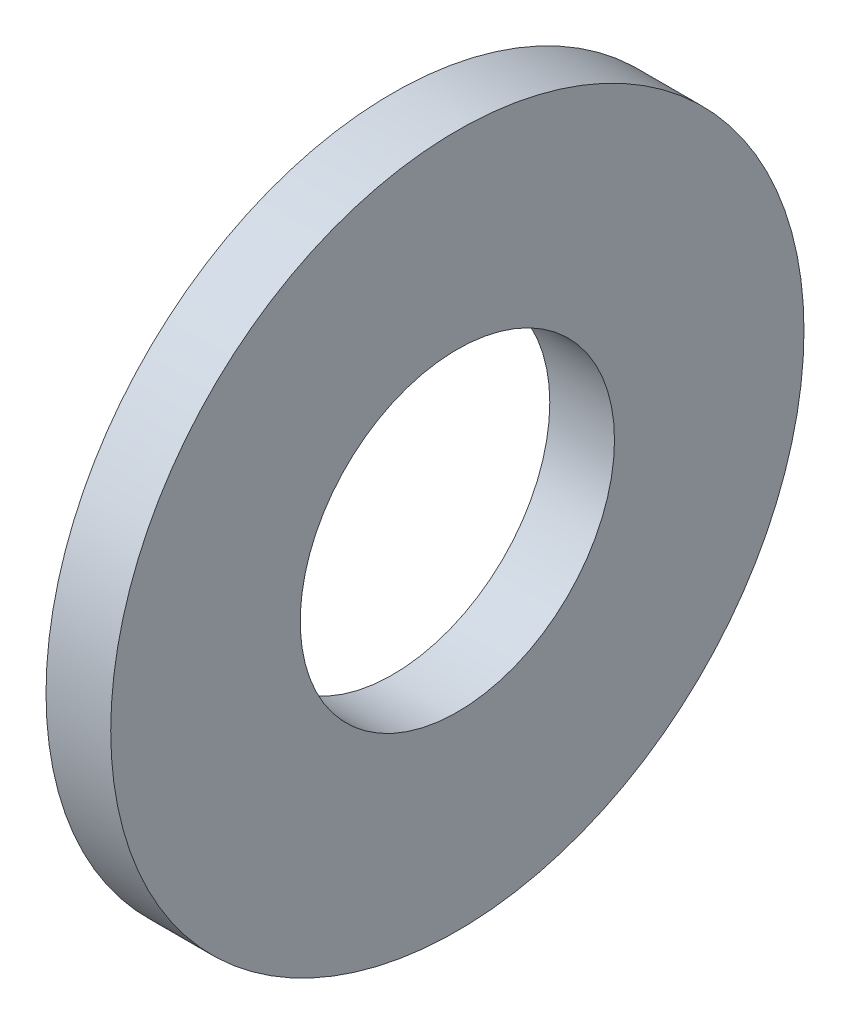
ISO-10303-21;
HEADER;
FILE_DESCRIPTION(('STEP AP214'),'2;1');
FILE_NAME('part.step','',(''),(''),'','','');
FILE_SCHEMA(('AUTOMOTIVE_DESIGN { 1 0 10303 214 1 1 1 1 }'));
ENDSEC;
DATA;
#1=APPLICATION_CONTEXT('core data for automotive mechanical design processes');
#2=APPLICATION_PROTOCOL_DEFINITION('international standard','automotive_design',2000,#1);
#3=PRODUCT_CONTEXT('',#1,'mechanical');
#4=PRODUCT('Part','Part','',(#3));
#5=PRODUCT_RELATED_PRODUCT_CATEGORY('part','',(#4));
#6=PRODUCT_DEFINITION_FORMATION('','',#4);
#7=PRODUCT_DEFINITION_CONTEXT('part definition',#1,'design');
#8=PRODUCT_DEFINITION('design','',#6,#7);
#9=PRODUCT_DEFINITION_SHAPE('','',#8);
#10=(LENGTH_UNIT() NAMED_UNIT(*) SI_UNIT(.MILLI.,.METRE.));
#11=(NAMED_UNIT(*) PLANE_ANGLE_UNIT() SI_UNIT($,.RADIAN.));
#12=(NAMED_UNIT(*) SI_UNIT($,.STERADIAN.) SOLID_ANGLE_UNIT());
#13=UNCERTAINTY_MEASURE_WITH_UNIT(LENGTH_MEASURE(1.E-05),#10,'distance_accuracy_value','');
#14=(GEOMETRIC_REPRESENTATION_CONTEXT(3) GLOBAL_UNCERTAINTY_ASSIGNED_CONTEXT((#13)) GLOBAL_UNIT_ASSIGNED_CONTEXT((#10,
#11,#12)) REPRESENTATION_CONTEXT('',''));
#15=CARTESIAN_POINT('',(0.,0.,0.));
#16=DIRECTION('',(0.,0.,1.));
#17=DIRECTION('',(1.,0.,0.));
#18=AXIS2_PLACEMENT_3D('',#15,#16,#17);
#19=CARTESIAN_POINT('',(0.889,0.,0.));
#20=DIRECTION('',(1.,0.,0.));
#21=DIRECTION('',(0.,0.,-1.));
#22=AXIS2_PLACEMENT_3D('',#19,#20,#21);
#23=PLANE('',#22);
#24=CARTESIAN_POINT('',(0.889,0.,0.));
#25=DIRECTION('',(1.,0.,0.));
#26=DIRECTION('',(0.,0.,-1.));
#27=AXIS2_PLACEMENT_3D('',#24,#25,#26);
#28=CIRCLE('',#27,4.7625);
#29=CARTESIAN_POINT('',(0.889,0.,-4.7625));
#30=VERTEX_POINT('',#29);
#31=EDGE_CURVE('E10',#30,#30,#28,.T.);
#32=ORIENTED_EDGE('',*,*,#31,.T.);
#33=EDGE_LOOP('',(#32));
#34=FACE_BOUND('',#33,.T.);
#35=CARTESIAN_POINT('',(0.889,0.,0.));
#36=DIRECTION('',(1.,0.,0.));
#37=DIRECTION('',(0.,0.,-1.));
#38=AXIS2_PLACEMENT_3D('',#35,#36,#37);
#39=CIRCLE('',#38,2.159);
#40=CARTESIAN_POINT('',(0.889,0.,-2.159));
#41=VERTEX_POINT('',#40);
#42=EDGE_CURVE('E41',#41,#41,#39,.T.);
#43=ORIENTED_EDGE('',*,*,#42,.F.);
#44=EDGE_LOOP('',(#43));
#45=FACE_BOUND('',#44,.T.);
#46=ADVANCED_FACE('F30',(#34,#45),#23,.T.);
#47=CARTESIAN_POINT('',(0.,0.,0.));
#48=DIRECTION('',(1.,0.,0.));
#49=DIRECTION('',(0.,0.,-1.));
#50=AXIS2_PLACEMENT_3D('',#47,#48,#49);
#51=PLANE('',#50);
#52=CARTESIAN_POINT('',(0.,0.,0.));
#53=DIRECTION('',(1.,0.,0.));
#54=DIRECTION('',(0.,0.,-1.));
#55=AXIS2_PLACEMENT_3D('',#52,#53,#54);
#56=CIRCLE('',#55,4.7625);
#57=CARTESIAN_POINT('',(0.,0.,-4.7625));
#58=VERTEX_POINT('',#57);
#59=EDGE_CURVE('E34',#58,#58,#56,.T.);
#60=ORIENTED_EDGE('',*,*,#59,.F.);
#61=EDGE_LOOP('',(#60));
#62=FACE_BOUND('',#61,.T.);
#63=CARTESIAN_POINT('',(0.,0.,0.));
#64=DIRECTION('',(1.,0.,0.));
#65=DIRECTION('',(0.,0.,-1.));
#66=AXIS2_PLACEMENT_3D('',#63,#64,#65);
#67=CIRCLE('',#66,2.159);
#68=CARTESIAN_POINT('',(0.,0.,-2.159));
#69=VERTEX_POINT('',#68);
#70=EDGE_CURVE('E43',#69,#69,#67,.T.);
#71=ORIENTED_EDGE('',*,*,#70,.T.);
#72=EDGE_LOOP('',(#71));
#73=FACE_BOUND('',#72,.T.);
#74=ADVANCED_FACE('F53',(#62,#73),#51,.F.);
#75=CARTESIAN_POINT('',(0.889,0.,0.));
#76=DIRECTION('',(-1.,0.,0.));
#77=DIRECTION('',(0.,0.,1.));
#78=AXIS2_PLACEMENT_3D('',#75,#76,#77);
#79=CYLINDRICAL_SURFACE('',#78,4.7625);
#80=ORIENTED_EDGE('',*,*,#31,.F.);
#81=EDGE_LOOP('',(#80));
#82=FACE_BOUND('',#81,.T.);
#83=ORIENTED_EDGE('',*,*,#59,.T.);
#84=EDGE_LOOP('',(#83));
#85=FACE_BOUND('',#84,.T.);
#86=ADVANCED_FACE('F32',(#82,#85),#79,.T.);
#87=CARTESIAN_POINT('',(0.889,0.,0.));
#88=DIRECTION('',(-1.,0.,0.));
#89=DIRECTION('',(0.,0.,1.));
#90=AXIS2_PLACEMENT_3D('',#87,#88,#89);
#91=CYLINDRICAL_SURFACE('',#90,2.159);
#92=ORIENTED_EDGE('',*,*,#42,.T.);
#93=EDGE_LOOP('',(#92));
#94=FACE_BOUND('',#93,.T.);
#95=ORIENTED_EDGE('',*,*,#70,.F.);
#96=EDGE_LOOP('',(#95));
#97=FACE_BOUND('',#96,.T.);
#98=ADVANCED_FACE('F49',(#94,#97),#91,.F.);
#99=CLOSED_SHELL('',(#46,#74,#86,#98));
#100=MANIFOLD_SOLID_BREP('B2',#99);
#101=ADVANCED_BREP_SHAPE_REPRESENTATION('',(#18,#100),#14);
#102=SHAPE_DEFINITION_REPRESENTATION(#9,#101);
ENDSEC;
END-ISO-10303-21;
